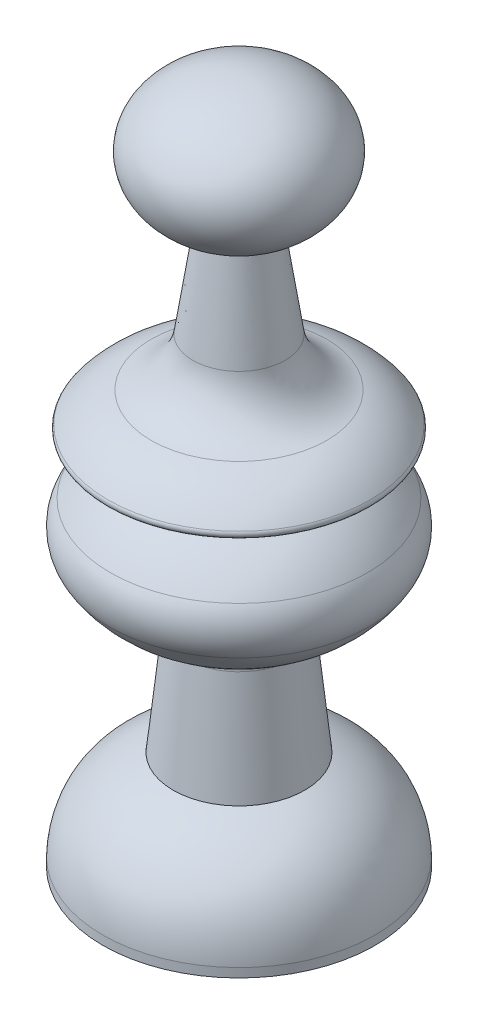
ISO-10303-21;
HEADER;
FILE_DESCRIPTION(('STEP AP214'),'2;1');
FILE_NAME('part.step','',(''),(''),'','','');
FILE_SCHEMA(('AUTOMOTIVE_DESIGN { 1 0 10303 214 1 1 1 1 }'));
ENDSEC;
DATA;
#1=APPLICATION_CONTEXT('core data for automotive mechanical design processes');
#2=APPLICATION_PROTOCOL_DEFINITION('international standard','automotive_design',2000,#1);
#3=PRODUCT_CONTEXT('',#1,'mechanical');
#4=PRODUCT('Part','Part','',(#3));
#5=PRODUCT_RELATED_PRODUCT_CATEGORY('part','',(#4));
#6=PRODUCT_DEFINITION_FORMATION('','',#4);
#7=PRODUCT_DEFINITION_CONTEXT('part definition',#1,'design');
#8=PRODUCT_DEFINITION('design','',#6,#7);
#9=PRODUCT_DEFINITION_SHAPE('','',#8);
#10=(LENGTH_UNIT() NAMED_UNIT(*) SI_UNIT(.MILLI.,.METRE.));
#11=(NAMED_UNIT(*) PLANE_ANGLE_UNIT() SI_UNIT($,.RADIAN.));
#12=(NAMED_UNIT(*) SI_UNIT($,.STERADIAN.) SOLID_ANGLE_UNIT());
#13=UNCERTAINTY_MEASURE_WITH_UNIT(LENGTH_MEASURE(1.E-05),#10,'distance_accuracy_value','');
#14=(GEOMETRIC_REPRESENTATION_CONTEXT(3) GLOBAL_UNCERTAINTY_ASSIGNED_CONTEXT((#13)) GLOBAL_UNIT_ASSIGNED_CONTEXT((#10,
#11,#12)) REPRESENTATION_CONTEXT('',''));
#15=CARTESIAN_POINT('',(0.,0.,0.));
#16=DIRECTION('',(0.,0.,1.));
#17=DIRECTION('',(1.,0.,0.));
#18=AXIS2_PLACEMENT_3D('',#15,#16,#17);
#19=CARTESIAN_POINT('',(0.,-0.762,0.));
#20=DIRECTION('',(0.,1.,0.));
#21=DIRECTION('',(0.,0.,1.));
#22=AXIS2_PLACEMENT_3D('',#19,#20,#21);
#23=CYLINDRICAL_SURFACE('',#22,11.5);
#24=CARTESIAN_POINT('',(0.,-0.762,0.));
#25=DIRECTION('',(0.,-1.,0.));
#26=DIRECTION('',(0.,0.,-1.));
#27=AXIS2_PLACEMENT_3D('',#24,#25,#26);
#28=CIRCLE('',#27,11.5);
#29=CARTESIAN_POINT('',(0.,-0.762,11.5));
#30=VERTEX_POINT('',#29);
#31=EDGE_CURVE('E11',#30,#30,#28,.T.);
#32=CARTESIAN_POINT('',(0.,0.,0.));
#33=DIRECTION('',(0.,-1.,0.));
#34=DIRECTION('',(0.,0.,-1.));
#35=AXIS2_PLACEMENT_3D('',#32,#33,#34);
#36=CIRCLE('',#35,11.5);
#37=CARTESIAN_POINT('',(0.,0.,11.5));
#38=VERTEX_POINT('',#37);
#39=EDGE_CURVE('E43',#38,#38,#36,.T.);
#40=CARTESIAN_POINT('',(0.,-0.762,11.5));
#41=CARTESIAN_POINT('',(0.,-0.7540625,11.5));
#42=CARTESIAN_POINT('',(0.,-0.746125,11.5));
#43=CARTESIAN_POINT('',(0.,-0.73025,11.5));
#44=CARTESIAN_POINT('',(0.,-0.7223125,11.5));
#45=CARTESIAN_POINT('',(0.,-0.7064375,11.5));
#46=CARTESIAN_POINT('',(0.,-0.6985,11.5));
#47=CARTESIAN_POINT('',(0.,-0.682625,11.5));
#48=CARTESIAN_POINT('',(0.,-0.6746875,11.5));
#49=CARTESIAN_POINT('',(0.,-0.6588125,11.5));
#50=CARTESIAN_POINT('',(0.,-0.650875,11.5));
#51=CARTESIAN_POINT('',(0.,-0.635,11.5));
#52=CARTESIAN_POINT('',(0.,-0.6270625,11.5));
#53=CARTESIAN_POINT('',(0.,-0.6111875,11.5));
#54=CARTESIAN_POINT('',(0.,-0.60325,11.5));
#55=CARTESIAN_POINT('',(0.,-0.587375,11.5));
#56=CARTESIAN_POINT('',(0.,-0.5794375,11.5));
#57=CARTESIAN_POINT('',(0.,-0.5635625,11.5));
#58=CARTESIAN_POINT('',(0.,-0.555625,11.5));
#59=CARTESIAN_POINT('',(0.,-0.53975,11.5));
#60=CARTESIAN_POINT('',(0.,-0.5318125,11.5));
#61=CARTESIAN_POINT('',(0.,-0.5159375,11.5));
#62=CARTESIAN_POINT('',(0.,-0.508,11.5));
#63=CARTESIAN_POINT('',(0.,-0.492125,11.5));
#64=CARTESIAN_POINT('',(0.,-0.4841875,11.5));
#65=CARTESIAN_POINT('',(0.,-0.4683125,11.5));
#66=CARTESIAN_POINT('',(0.,-0.460375,11.5));
#67=CARTESIAN_POINT('',(0.,-0.4445,11.5));
#68=CARTESIAN_POINT('',(0.,-0.4365625,11.5));
#69=CARTESIAN_POINT('',(0.,-0.4206875,11.5));
#70=CARTESIAN_POINT('',(0.,-0.41275,11.5));
#71=CARTESIAN_POINT('',(0.,-0.396875,11.5));
#72=CARTESIAN_POINT('',(0.,-0.3889375,11.5));
#73=CARTESIAN_POINT('',(0.,-0.3730625,11.5));
#74=CARTESIAN_POINT('',(0.,-0.365125,11.5));
#75=CARTESIAN_POINT('',(0.,-0.34925,11.5));
#76=CARTESIAN_POINT('',(0.,-0.3413125,11.5));
#77=CARTESIAN_POINT('',(0.,-0.3254375,11.5));
#78=CARTESIAN_POINT('',(0.,-0.3175,11.5));
#79=CARTESIAN_POINT('',(0.,-0.301625,11.5));
#80=CARTESIAN_POINT('',(0.,-0.2936875,11.5));
#81=CARTESIAN_POINT('',(0.,-0.2778125,11.5));
#82=CARTESIAN_POINT('',(0.,-0.269875,11.5));
#83=CARTESIAN_POINT('',(0.,-0.254,11.5));
#84=CARTESIAN_POINT('',(0.,-0.2460625,11.5));
#85=CARTESIAN_POINT('',(0.,-0.2301875,11.5));
#86=CARTESIAN_POINT('',(0.,-0.22225,11.5));
#87=CARTESIAN_POINT('',(0.,-0.206375,11.5));
#88=CARTESIAN_POINT('',(0.,-0.1984375,11.5));
#89=CARTESIAN_POINT('',(0.,-0.1825625,11.5));
#90=CARTESIAN_POINT('',(0.,-0.174625,11.5));
#91=CARTESIAN_POINT('',(0.,-0.15875,11.5));
#92=CARTESIAN_POINT('',(0.,-0.1508125,11.5));
#93=CARTESIAN_POINT('',(0.,-0.1349375,11.5));
#94=CARTESIAN_POINT('',(0.,-0.127,11.5));
#95=CARTESIAN_POINT('',(0.,-0.111125,11.5));
#96=CARTESIAN_POINT('',(0.,-0.1031875,11.5));
#97=CARTESIAN_POINT('',(0.,-0.0873125,11.5));
#98=CARTESIAN_POINT('',(0.,-0.079375,11.5));
#99=CARTESIAN_POINT('',(0.,-0.0635,11.5));
#100=CARTESIAN_POINT('',(0.,-0.0555625,11.5));
#101=CARTESIAN_POINT('',(0.,-0.0396875,11.5));
#102=CARTESIAN_POINT('',(0.,-0.03175,11.5));
#103=CARTESIAN_POINT('',(0.,-0.015875,11.5));
#104=CARTESIAN_POINT('',(0.,-0.00793749999999999,11.5));
#105=CARTESIAN_POINT('',(0.,0.,11.5));
#106=B_SPLINE_CURVE_WITH_KNOTS('',3,(#40,#41,#42,#43,#44,#45,#46,#47,#48,#49,#50,#51,#52,#53,
#54,#55,#56,#57,#58,#59,#60,#61,#62,#63,#64,#65,#66,#67,#68,#69,#70,#71,#72,#73,#74,#75,#76,#77,
#78,#79,#80,#81,#82,#83,#84,#85,#86,#87,#88,#89,#90,#91,#92,#93,#94,#95,#96,#97,#98,#99,#100,
#101,#102,#103,#104,#105),.UNSPECIFIED.,.F.,.F.,(4,2,2,2,2,2,2,2,2,2,2,2,2,2,2,2,2,2,2,2,2,2,2,
2,2,2,2,2,2,2,2,2,4),(0.,0.0238125000000001,0.047625,0.0714375,0.0952500000000001,0.1190625,
0.142875,0.1666875,0.1905,0.2143125,0.238125,0.2619375,0.28575,0.3095625,0.333375,0.3571875,
0.381,0.4048125,0.428625,0.4524375,0.47625,0.5000625,0.523875,0.5476875,0.5715,0.5953125,
0.619125,0.6429375,0.66675,0.6905625,0.714375,0.7381875,0.762),.UNSPECIFIED.);
#107=EDGE_CURVE('BSEAM40',#30,#38,#106,.T.);
#108=ORIENTED_EDGE('',*,*,#31,.F.);
#109=ORIENTED_EDGE('',*,*,#39,.T.);
#110=ORIENTED_EDGE('',*,*,#107,.T.);
#111=ORIENTED_EDGE('',*,*,#107,.F.);
#112=EDGE_LOOP('',(#108,#110,#109,#111));
#113=FACE_BOUND('',#112,.T.);
#114=ADVANCED_FACE('F40',(#113),#23,.T.);
#115=CARTESIAN_POINT('',(0.,-0.762,0.));
#116=DIRECTION('',(0.,-1.,0.));
#117=DIRECTION('',(0.,0.,-1.));
#118=AXIS2_PLACEMENT_3D('',#115,#116,#117);
#119=PLANE('',#118);
#120=ORIENTED_EDGE('',*,*,#31,.T.);
#121=EDGE_LOOP('',(#120));
#122=FACE_BOUND('',#121,.T.);
#123=ADVANCED_FACE('F55',(#122),#119,.T.);
#124=CARTESIAN_POINT('',(0.,0.,0.));
#125=DIRECTION('',(0.,-1.,0.));
#126=DIRECTION('',(0.,0.,-1.));
#127=AXIS2_PLACEMENT_3D('',#124,#125,#126);
#128=PLANE('',#127);
#129=ORIENTED_EDGE('',*,*,#39,.F.);
#130=EDGE_LOOP('',(#129));
#131=FACE_BOUND('',#130,.T.);
#132=ADVANCED_FACE('F53',(#131),#128,.F.);
#133=CLOSED_SHELL('',(#114,#123,#132));
#134=MANIFOLD_SOLID_BREP('B2',#133);
#135=CARTESIAN_POINT('',(0.,51.5874,0.));
#136=DIRECTION('',(0.,0.,1.));
#137=DIRECTION('',(-1.,0.,0.));
#138=AXIS2_PLACEMENT_3D('',#135,#136,#137);
#139=ELLIPSE('',#138,7.5,5.5626);
#140=TRIMMED_CURVE('',#139,(PARAMETER_VALUE(4.71238898038469)),
(PARAMETER_VALUE(7.85398163397448)),.T.,.PARAMETER.);
#141=CARTESIAN_POINT('',(0.,57.15,0.));
#142=DIRECTION('',(0.,1.,0.));
#143=AXIS1_PLACEMENT('',#141,#142);
#144=SURFACE_OF_REVOLUTION('',#140,#143);
#145=CARTESIAN_POINT('',(0.,46.3883813251949,0.));
#146=DIRECTION('',(0.,1.,0.));
#147=DIRECTION('',(0.,0.,1.));
#148=AXIS2_PLACEMENT_3D('',#145,#146,#147);
#149=CIRCLE('',#148,2.667);
#150=CARTESIAN_POINT('',(0.,46.3883813251949,2.667));
#151=VERTEX_POINT('',#150);
#152=EDGE_CURVE('E181',#151,#151,#149,.T.);
#153=ORIENTED_EDGE('',*,*,#152,.T.);
#154=EDGE_LOOP('',(#153));
#155=FACE_BOUND('',#154,.T.);
#156=CARTESIAN_POINT('',(0.,57.15,0.));
#157=VERTEX_POINT('',#156);
#158=VERTEX_LOOP('',#157);
#159=FACE_BOUND('',#158,.T.);
#160=ADVANCED_FACE('F80',(#155,#159),#144,.F.);
#161=CARTESIAN_POINT('',(0.,46.3883813251949,0.));
#162=DIRECTION('',(0.,-1.,0.));
#163=DIRECTION('',(0.,0.,-1.));
#164=AXIS2_PLACEMENT_3D('',#161,#162,#163);
#165=CONICAL_SURFACE('',#164,2.667,0.148936487119344);
#166=CARTESIAN_POINT('',(0.,38.2255562459417,0.));
#167=DIRECTION('',(0.,-1.,0.));
#168=DIRECTION('',(0.,0.,-1.));
#169=AXIS2_PLACEMENT_3D('',#166,#167,#168);
#170=CIRCLE('',#169,3.89181220609037);
#171=CARTESIAN_POINT('',(0.,38.2255562459417,-3.89181220609037));
#172=VERTEX_POINT('',#171);
#173=EDGE_CURVE('E87',#172,#172,#170,.F.);
#174=ORIENTED_EDGE('',*,*,#173,.T.);
#175=EDGE_LOOP('',(#174));
#176=FACE_BOUND('',#175,.T.);
#177=ORIENTED_EDGE('',*,*,#152,.F.);
#178=EDGE_LOOP('',(#177));
#179=FACE_BOUND('',#178,.T.);
#180=ADVANCED_FACE('F91',(#176,#179),#165,.T.);
#181=CARTESIAN_POINT('',(-4.445,34.5388072282485,0.));
#182=CARTESIAN_POINT('',(-9.19816109145442,34.5482993297111,0.));
#183=CARTESIAN_POINT('',(-11.5,30.988,0.));
#184=B_SPLINE_CURVE_WITH_KNOTS('',2,(#181,#182,#183),.UNSPECIFIED.,.F.,.F.,(3,3),(0.,1.),.UNSPECIFIED.);
#185=CARTESIAN_POINT('',(0.,57.15,0.));
#186=DIRECTION('',(0.,1.,0.));
#187=AXIS1_PLACEMENT('',#185,#186);
#188=SURFACE_OF_REVOLUTION('',#184,#187);
#189=CARTESIAN_POINT('',(0.,34.1269149765701,0.));
#190=DIRECTION('',(0.,1.,0.));
#191=DIRECTION('',(0.,0.,1.));
#192=AXIS2_PLACEMENT_3D('',#189,#190,#191);
#193=CIRCLE('',#192,7.41218374940522);
#194=CARTESIAN_POINT('',(0.,34.1269149765701,7.41218374940522));
#195=VERTEX_POINT('',#194);
#196=EDGE_CURVE('E38',#195,#195,#193,.F.);
#197=ORIENTED_EDGE('',*,*,#196,.T.);
#198=EDGE_LOOP('',(#197));
#199=FACE_BOUND('',#198,.T.);
#200=CARTESIAN_POINT('',(0.,31.603252244644,0.));
#201=DIRECTION('',(0.,1.,0.));
#202=DIRECTION('',(0.,0.,1.));
#203=AXIS2_PLACEMENT_3D('',#200,#201,#202);
#204=CIRCLE('',#203,11.063231317849);
#205=CARTESIAN_POINT('',(0.,31.603252244644,11.063231317849));
#206=VERTEX_POINT('',#205);
#207=EDGE_CURVE('E183',#206,#206,#204,.T.);
#208=ORIENTED_EDGE('',*,*,#207,.T.);
#209=EDGE_LOOP('',(#208));
#210=FACE_BOUND('',#209,.T.);
#211=ADVANCED_FACE('F97',(#199,#210),#188,.F.);
#212=CARTESIAN_POINT('',(-4.4595788736174,30.988,0.));
#213=DIRECTION('',(0.,-1.,0.));
#214=DIRECTION('',(0.,0.,-1.));
#215=AXIS2_PLACEMENT_3D('',#212,#213,#214);
#216=PLANE('',#215);
#217=CARTESIAN_POINT('',(0.,30.988,0.));
#218=DIRECTION('',(0.,-1.,0.));
#219=DIRECTION('',(0.,0.,-1.));
#220=AXIS2_PLACEMENT_3D('',#217,#218,#219);
#221=CIRCLE('',#220,10.7627535551456);
#222=CARTESIAN_POINT('',(0.,30.988,-10.7627535551456));
#223=VERTEX_POINT('',#222);
#224=EDGE_CURVE('E189',#223,#223,#221,.T.);
#225=ORIENTED_EDGE('',*,*,#224,.T.);
#226=EDGE_LOOP('',(#225));
#227=FACE_BOUND('',#226,.T.);
#228=CARTESIAN_POINT('',(0.,30.988,0.));
#229=DIRECTION('',(0.,-1.,0.));
#230=DIRECTION('',(0.,0.,-1.));
#231=AXIS2_PLACEMENT_3D('',#228,#229,#230);
#232=CIRCLE('',#231,4.8405788736174);
#233=CARTESIAN_POINT('',(0.,30.988,-4.8405788736174));
#234=VERTEX_POINT('',#233);
#235=EDGE_CURVE('E186',#234,#234,#232,.F.);
#236=ORIENTED_EDGE('',*,*,#235,.T.);
#237=EDGE_LOOP('',(#236));
#238=FACE_BOUND('',#237,.T.);
#239=ADVANCED_FACE('F121',(#227,#238),#216,.T.);
#240=CARTESIAN_POINT('',(0.,57.15,0.));
#241=DIRECTION('',(0.,1.,0.));
#242=DIRECTION('',(0.,0.,1.));
#243=AXIS2_PLACEMENT_3D('',#240,#241,#242);
#244=CYLINDRICAL_SURFACE('',#243,4.4595788736174);
#245=CARTESIAN_POINT('',(0.,30.607,0.));
#246=DIRECTION('',(0.,-1.,0.));
#247=DIRECTION('',(0.,0.,-1.));
#248=AXIS2_PLACEMENT_3D('',#245,#246,#247);
#249=CIRCLE('',#248,4.4595788736174);
#250=CARTESIAN_POINT('',(0.,30.607,-4.4595788736174));
#251=VERTEX_POINT('',#250);
#252=EDGE_CURVE('E195',#251,#251,#249,.T.);
#253=ORIENTED_EDGE('',*,*,#252,.T.);
#254=EDGE_LOOP('',(#253));
#255=FACE_BOUND('',#254,.T.);
#256=CARTESIAN_POINT('',(0.,30.4148833070592,0.));
#257=DIRECTION('',(0.,1.,0.));
#258=DIRECTION('',(0.,0.,1.));
#259=AXIS2_PLACEMENT_3D('',#256,#257,#258);
#260=CIRCLE('',#259,4.4595788736174);
#261=CARTESIAN_POINT('',(0.,30.4148833070592,4.4595788736174));
#262=VERTEX_POINT('',#261);
#263=EDGE_CURVE('E192',#262,#262,#260,.T.);
#264=ORIENTED_EDGE('',*,*,#263,.T.);
#265=EDGE_LOOP('',(#264));
#266=FACE_BOUND('',#265,.T.);
#267=ADVANCED_FACE('F125',(#255,#266),#244,.T.);
#268=CARTESIAN_POINT('',(0.,20.9247113657962,0.));
#269=DIRECTION('',(0.,1.,0.));
#270=DIRECTION('',(0.,0.,1.));
#271=AXIS2_PLACEMENT_3D('',#268,#269,#270);
#272=DEGENERATE_TOROIDAL_SURFACE('',#271,3.27286355674606,9.23778863420382,.T.);
#273=CARTESIAN_POINT('',(0.,30.0389778113543,0.));
#274=DIRECTION('',(0.,-1.,0.));
#275=DIRECTION('',(0.,0.,-1.));
#276=AXIS2_PLACEMENT_3D('',#273,#274,#275);
#277=CIRCLE('',#276,4.77848170541433);
#278=CARTESIAN_POINT('',(0.,30.0389778113543,-4.77848170541433));
#279=VERTEX_POINT('',#278);
#280=EDGE_CURVE('E198',#279,#279,#277,.T.);
#281=ORIENTED_EDGE('',*,*,#280,.T.);
#282=EDGE_LOOP('',(#281));
#283=FACE_BOUND('',#282,.T.);
#284=CARTESIAN_POINT('',(0.,26.1838587753556,0.));
#285=DIRECTION('',(0.,1.,0.));
#286=DIRECTION('',(0.,0.,1.));
#287=AXIS2_PLACEMENT_3D('',#284,#285,#286);
#288=CIRCLE('',#287,10.8674739730051);
#289=CARTESIAN_POINT('',(0.,26.1838587753556,10.8674739730051));
#290=VERTEX_POINT('',#289);
#291=EDGE_CURVE('E178',#290,#290,#288,.T.);
#292=ORIENTED_EDGE('',*,*,#291,.T.);
#293=EDGE_LOOP('',(#292));
#294=FACE_BOUND('',#293,.T.);
#295=ADVANCED_FACE('F129',(#283,#294),#272,.T.);
#296=CARTESIAN_POINT('',(0.,24.1593993588293,0.));
#297=DIRECTION('',(0.,1.,0.));
#298=DIRECTION('',(0.,0.,1.));
#299=AXIS2_PLACEMENT_3D('',#296,#297,#298);
#300=TOROIDAL_SURFACE('',#299,7.944,3.556);
#301=CARTESIAN_POINT('',(0.,22.2413344909624,0.));
#302=DIRECTION('',(0.,1.,0.));
#303=DIRECTION('',(0.,0.,1.));
#304=AXIS2_PLACEMENT_3D('',#301,#302,#303);
#305=CIRCLE('',#304,10.9383552165124);
#306=CARTESIAN_POINT('',(0.,22.2413344909624,10.9383552165124));
#307=VERTEX_POINT('',#306);
#308=EDGE_CURVE('E175',#307,#307,#305,.T.);
#309=ORIENTED_EDGE('',*,*,#308,.T.);
#310=EDGE_LOOP('',(#309));
#311=FACE_BOUND('',#310,.T.);
#312=ORIENTED_EDGE('',*,*,#291,.F.);
#313=EDGE_LOOP('',(#312));
#314=FACE_BOUND('',#313,.T.);
#315=ADVANCED_FACE('F133',(#311,#314),#300,.T.);
#316=CARTESIAN_POINT('',(0.,27.151543595896,0.));
#317=DIRECTION('',(0.,1.,0.));
#318=DIRECTION('',(0.,0.,1.));
#319=AXIS2_PLACEMENT_3D('',#316,#317,#318);
#320=DEGENERATE_TOROIDAL_SURFACE('',#319,3.27286355674606,9.10329148386005,.T.);
#321=CARTESIAN_POINT('',(0.,18.3811568773071,0.));
#322=DIRECTION('',(0.,1.,0.));
#323=DIRECTION('',(0.,0.,1.));
#324=AXIS2_PLACEMENT_3D('',#321,#322,#323);
#325=CIRCLE('',#324,5.71217342769698);
#326=CARTESIAN_POINT('',(0.,18.3811568773071,5.71217342769698));
#327=VERTEX_POINT('',#326);
#328=EDGE_CURVE('E172',#327,#327,#325,.T.);
#329=ORIENTED_EDGE('',*,*,#328,.T.);
#330=EDGE_LOOP('',(#329));
#331=FACE_BOUND('',#330,.T.);
#332=ORIENTED_EDGE('',*,*,#308,.F.);
#333=EDGE_LOOP('',(#332));
#334=FACE_BOUND('',#333,.T.);
#335=ADVANCED_FACE('F137',(#331,#334),#320,.T.);
#336=CARTESIAN_POINT('',(0.,16.9128891213171,0.));
#337=DIRECTION('',(0.,1.,0.));
#338=DIRECTION('',(0.,0.,1.));
#339=AXIS2_PLACEMENT_3D('',#336,#337,#338);
#340=TOROIDAL_SURFACE('',#339,6.12054310913806,1.524);
#341=CARTESIAN_POINT('',(0.,16.7550493432857,0.));
#342=DIRECTION('',(0.,1.,0.));
#343=DIRECTION('',(0.,0.,1.));
#344=AXIS2_PLACEMENT_3D('',#341,#342,#343);
#345=CIRCLE('',#344,4.60473883269898);
#346=CARTESIAN_POINT('',(0.,16.7550493432857,4.60473883269898));
#347=VERTEX_POINT('',#346);
#348=EDGE_CURVE('E167',#347,#347,#345,.T.);
#349=ORIENTED_EDGE('',*,*,#348,.T.);
#350=EDGE_LOOP('',(#349));
#351=FACE_BOUND('',#350,.T.);
#352=ORIENTED_EDGE('',*,*,#328,.F.);
#353=EDGE_LOOP('',(#352));
#354=FACE_BOUND('',#353,.T.);
#355=ADVANCED_FACE('F141',(#351,#354),#340,.F.);
#356=CARTESIAN_POINT('',(0.,16.7550493432857,0.));
#357=DIRECTION('',(0.,-1.,0.));
#358=DIRECTION('',(0.,0.,-1.));
#359=AXIS2_PLACEMENT_3D('',#356,#357,#358);
#360=CONICAL_SURFACE('',#359,4.60473883269898,0.103755465981784);
#361=CARTESIAN_POINT('',(0.,7.61727232368625,0.));
#362=DIRECTION('',(0.,1.,0.));
#363=DIRECTION('',(0.,0.,1.));
#364=AXIS2_PLACEMENT_3D('',#361,#362,#363);
#365=CIRCLE('',#364,5.55625);
#366=CARTESIAN_POINT('',(0.,7.61727232368625,5.55625));
#367=VERTEX_POINT('',#366);
#368=EDGE_CURVE('E165',#367,#367,#365,.T.);
#369=ORIENTED_EDGE('',*,*,#368,.T.);
#370=EDGE_LOOP('',(#369));
#371=FACE_BOUND('',#370,.T.);
#372=ORIENTED_EDGE('',*,*,#348,.F.);
#373=EDGE_LOOP('',(#372));
#374=FACE_BOUND('',#373,.T.);
#375=ADVANCED_FACE('F145',(#371,#374),#360,.T.);
#376=CARTESIAN_POINT('',(-5.55625,7.61727232368625,0.));
#377=CARTESIAN_POINT('',(-11.2207392934526,5.54480325649878,0.));
#378=CARTESIAN_POINT('',(-11.5,0.,0.));
#379=B_SPLINE_CURVE_WITH_KNOTS('',2,(#376,#377,#378),.UNSPECIFIED.,.F.,.F.,(3,3),(0.,1.),.UNSPECIFIED.);
#380=CARTESIAN_POINT('',(0.,57.15,0.));
#381=DIRECTION('',(0.,1.,0.));
#382=AXIS1_PLACEMENT('',#380,#381);
#383=SURFACE_OF_REVOLUTION('',#379,#382);
#384=CARTESIAN_POINT('',(0.,0.,0.));
#385=DIRECTION('',(0.,1.,0.));
#386=DIRECTION('',(0.,0.,1.));
#387=AXIS2_PLACEMENT_3D('',#384,#385,#386);
#388=CIRCLE('',#387,11.5);
#389=CARTESIAN_POINT('',(0.,0.,11.5));
#390=VERTEX_POINT('',#389);
#391=EDGE_CURVE('E164',#390,#390,#388,.T.);
#392=ORIENTED_EDGE('',*,*,#391,.T.);
#393=EDGE_LOOP('',(#392));
#394=FACE_BOUND('',#393,.T.);
#395=ORIENTED_EDGE('',*,*,#368,.F.);
#396=EDGE_LOOP('',(#395));
#397=FACE_BOUND('',#396,.T.);
#398=ADVANCED_FACE('F149',(#394,#397),#383,.F.);
#399=CARTESIAN_POINT('',(0.,0.,0.));
#400=DIRECTION('',(0.,-1.,0.));
#401=DIRECTION('',(0.,0.,-1.));
#402=AXIS2_PLACEMENT_3D('',#399,#400,#401);
#403=PLANE('',#402);
#404=ORIENTED_EDGE('',*,*,#391,.F.);
#405=EDGE_LOOP('',(#404));
#406=FACE_BOUND('',#405,.T.);
#407=ADVANCED_FACE('F153',(#406),#403,.T.);
#408=CARTESIAN_POINT('',(0.,31.369,0.));
#409=DIRECTION('',(0.,1.,0.));
#410=DIRECTION('',(0.,0.,1.));
#411=AXIS2_PLACEMENT_3D('',#408,#409,#410);
#412=TOROIDAL_SURFACE('',#411,10.7627535551456,0.381);
#413=ORIENTED_EDGE('',*,*,#224,.F.);
#414=EDGE_LOOP('',(#413));
#415=FACE_BOUND('',#414,.T.);
#416=ORIENTED_EDGE('',*,*,#207,.F.);
#417=EDGE_LOOP('',(#416));
#418=FACE_BOUND('',#417,.T.);
#419=ADVANCED_FACE('F104',(#415,#418),#412,.T.);
#420=CARTESIAN_POINT('',(0.,30.607,0.));
#421=DIRECTION('',(0.,-1.,0.));
#422=DIRECTION('',(0.,0.,-1.));
#423=AXIS2_PLACEMENT_3D('',#420,#421,#422);
#424=TOROIDAL_SURFACE('',#423,4.8405788736174,0.381);
#425=ORIENTED_EDGE('',*,*,#252,.F.);
#426=EDGE_LOOP('',(#425));
#427=FACE_BOUND('',#426,.T.);
#428=ORIENTED_EDGE('',*,*,#235,.F.);
#429=EDGE_LOOP('',(#428));
#430=FACE_BOUND('',#429,.T.);
#431=ADVANCED_FACE('F160',(#427,#430),#424,.F.);
#432=CARTESIAN_POINT('',(0.,30.4148833070592,0.));
#433=DIRECTION('',(0.,1.,0.));
#434=DIRECTION('',(0.,0.,1.));
#435=AXIS2_PLACEMENT_3D('',#432,#433,#434);
#436=TOROIDAL_SURFACE('',#435,4.8405788736174,0.381);
#437=ORIENTED_EDGE('',*,*,#280,.F.);
#438=EDGE_LOOP('',(#437));
#439=FACE_BOUND('',#438,.T.);
#440=ORIENTED_EDGE('',*,*,#263,.F.);
#441=EDGE_LOOP('',(#440));
#442=FACE_BOUND('',#441,.T.);
#443=ADVANCED_FACE('F205',(#439,#442),#436,.F.);
#444=CARTESIAN_POINT('',(0.,38.9793595510459,0.));
#445=DIRECTION('',(0.,1.,0.));
#446=DIRECTION('',(0.,0.,1.));
#447=AXIS2_PLACEMENT_3D('',#444,#445,#446);
#448=TOROIDAL_SURFACE('',#447,8.91557380246554,5.08);
#449=ORIENTED_EDGE('',*,*,#196,.F.);
#450=EDGE_LOOP('',(#449));
#451=FACE_BOUND('',#450,.T.);
#452=ORIENTED_EDGE('',*,*,#173,.F.);
#453=EDGE_LOOP('',(#452));
#454=FACE_BOUND('',#453,.T.);
#455=ADVANCED_FACE('F82',(#451,#454),#448,.F.);
#456=CLOSED_SHELL('',(#160,#180,#211,#239,#267,#295,#315,#335,#355,#375,#398,#407,#419,#431,
#443,#455));
#457=MANIFOLD_SOLID_BREP('B6',#456);
#458=ADVANCED_BREP_SHAPE_REPRESENTATION('',(#18,#134,#457),#14);
#459=SHAPE_DEFINITION_REPRESENTATION(#9,#458);
ENDSEC;
END-ISO-10303-21;
